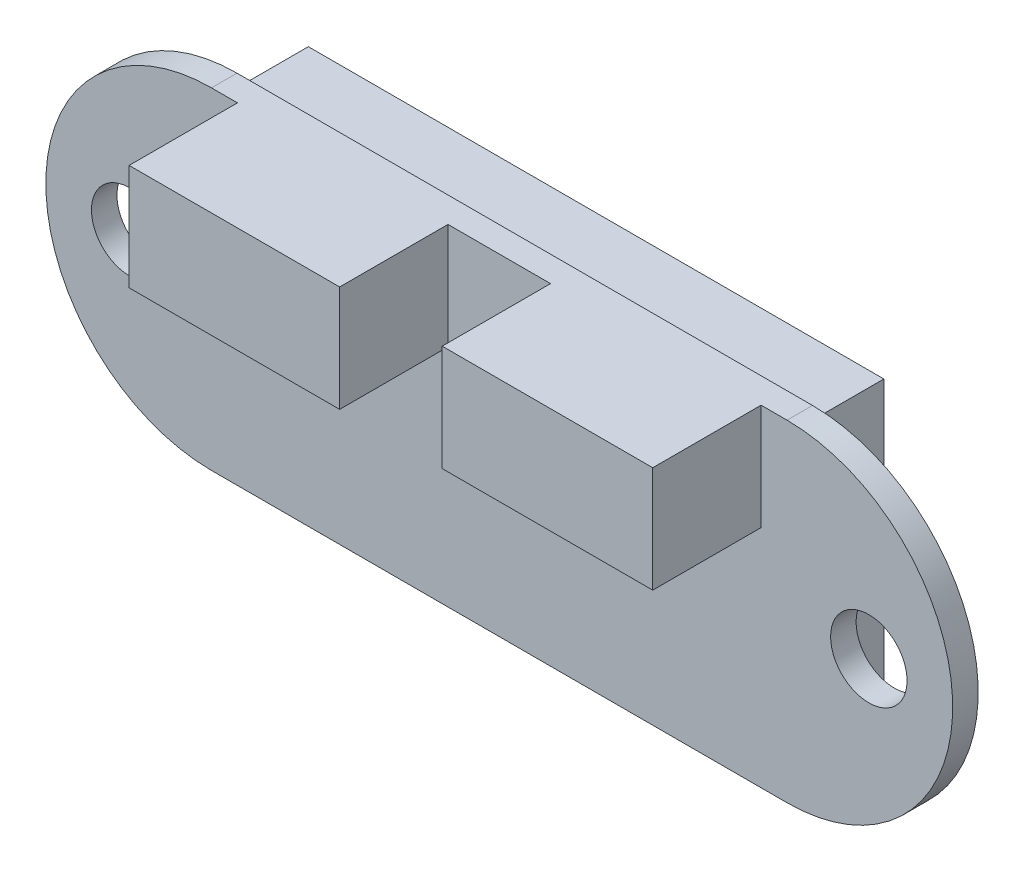
ISO-10303-21;
HEADER;
FILE_DESCRIPTION(('STEP AP214'),'2;1');
FILE_NAME('part.step','',(''),(''),'','','');
FILE_SCHEMA(('AUTOMOTIVE_DESIGN { 1 0 10303 214 1 1 1 1 }'));
ENDSEC;
DATA;
#1=APPLICATION_CONTEXT('core data for automotive mechanical design processes');
#2=APPLICATION_PROTOCOL_DEFINITION('international standard','automotive_design',2000,#1);
#3=PRODUCT_CONTEXT('',#1,'mechanical');
#4=PRODUCT('Part','Part','',(#3));
#5=PRODUCT_RELATED_PRODUCT_CATEGORY('part','',(#4));
#6=PRODUCT_DEFINITION_FORMATION('','',#4);
#7=PRODUCT_DEFINITION_CONTEXT('part definition',#1,'design');
#8=PRODUCT_DEFINITION('design','',#6,#7);
#9=PRODUCT_DEFINITION_SHAPE('','',#8);
#10=(LENGTH_UNIT() NAMED_UNIT(*) SI_UNIT(.MILLI.,.METRE.));
#11=(NAMED_UNIT(*) PLANE_ANGLE_UNIT() SI_UNIT($,.RADIAN.));
#12=(NAMED_UNIT(*) SI_UNIT($,.STERADIAN.) SOLID_ANGLE_UNIT());
#13=UNCERTAINTY_MEASURE_WITH_UNIT(LENGTH_MEASURE(1.E-05),#10,'distance_accuracy_value','');
#14=(GEOMETRIC_REPRESENTATION_CONTEXT(3) GLOBAL_UNCERTAINTY_ASSIGNED_CONTEXT((#13)) GLOBAL_UNIT_ASSIGNED_CONTEXT((#10,
#11,#12)) REPRESENTATION_CONTEXT('',''));
#15=CARTESIAN_POINT('',(0.,0.,0.));
#16=DIRECTION('',(0.,0.,1.));
#17=DIRECTION('',(1.,0.,0.));
#18=AXIS2_PLACEMENT_3D('',#15,#16,#17);
#19=CARTESIAN_POINT('',(-51.0283291556503,22.118710574771,1.));
#20=DIRECTION('',(0.,0.,1.));
#21=DIRECTION('',(1.,0.,0.));
#22=AXIS2_PLACEMENT_3D('',#19,#20,#21);
#23=PLANE('',#22);
#24=CARTESIAN_POINT('',(-76.8183291556503,22.118710574771,1.));
#25=DIRECTION('',(0.,0.,1.));
#26=DIRECTION('',(1.,0.,0.));
#27=AXIS2_PLACEMENT_3D('',#24,#25,#26);
#28=CIRCLE('',#27,1.5);
#29=CARTESIAN_POINT('',(-75.3183291556503,22.118710574771,1.));
#30=VERTEX_POINT('',#29);
#31=EDGE_CURVE('E366',#30,#30,#28,.T.);
#32=ORIENTED_EDGE('',*,*,#31,.F.);
#33=EDGE_LOOP('',(#32));
#34=FACE_BOUND('',#33,.T.);
#35=CARTESIAN_POINT('',(-47.8183291556503,22.118710574771,1.));
#36=DIRECTION('',(0.,0.,1.));
#37=DIRECTION('',(-1.,0.,0.));
#38=AXIS2_PLACEMENT_3D('',#35,#36,#37);
#39=CIRCLE('',#38,1.5);
#40=CARTESIAN_POINT('',(-49.3183291556503,22.118710574771,1.));
#41=VERTEX_POINT('',#40);
#42=EDGE_CURVE('E358',#41,#41,#39,.T.);
#43=ORIENTED_EDGE('',*,*,#42,.F.);
#44=EDGE_LOOP('',(#43));
#45=FACE_BOUND('',#44,.T.);
#46=DIRECTION('',(-1.,0.,0.));
#47=VECTOR('',#46,1.);
#48=CARTESIAN_POINT('',(-73.6083291556503,28.618710574771,1.));
#49=LINE('',#48,#47);
#50=CARTESIAN_POINT('',(-51.0283291556503,28.618710574771,1.));
#51=VERTEX_POINT('',#50);
#52=CARTESIAN_POINT('',(-52.0464927091246,28.618710574771,1.));
#53=VERTEX_POINT('',#52);
#54=EDGE_CURVE('E191',#51,#53,#49,.T.);
#55=ORIENTED_EDGE('',*,*,#54,.T.);
#56=DIRECTION('',(0.,1.,0.));
#57=VECTOR('',#56,1.);
#58=CARTESIAN_POINT('',(-52.0464927091246,24.458710574771,1.));
#59=LINE('',#58,#57);
#60=CARTESIAN_POINT('',(-52.0464927091246,24.458710574771,1.));
#61=VERTEX_POINT('',#60);
#62=EDGE_CURVE('E66',#61,#53,#59,.T.);
#63=ORIENTED_EDGE('',*,*,#62,.F.);
#64=DIRECTION('',(1.,0.,0.));
#65=VECTOR('',#64,1.);
#66=CARTESIAN_POINT('',(-52.0464927091246,24.458710574771,1.));
#67=LINE('',#66,#65);
#68=CARTESIAN_POINT('',(-60.3064927091246,24.458710574771,1.));
#69=VERTEX_POINT('',#68);
#70=EDGE_CURVE('E61',#69,#61,#67,.T.);
#71=ORIENTED_EDGE('',*,*,#70,.F.);
#72=DIRECTION('',(0.,-1.,0.));
#73=VECTOR('',#72,1.);
#74=CARTESIAN_POINT('',(-60.3064927091246,24.458710574771,1.));
#75=LINE('',#74,#73);
#76=CARTESIAN_POINT('',(-60.3064927091246,28.618710574771,1.));
#77=VERTEX_POINT('',#76);
#78=EDGE_CURVE('E194',#77,#69,#75,.T.);
#79=ORIENTED_EDGE('',*,*,#78,.F.);
#80=CARTESIAN_POINT('',(-64.3301656021761,28.618710574771,1.));
#81=VERTEX_POINT('',#80);
#82=EDGE_CURVE('E182',#77,#81,#49,.T.);
#83=ORIENTED_EDGE('',*,*,#82,.T.);
#84=DIRECTION('',(0.,1.,0.));
#85=VECTOR('',#84,1.);
#86=CARTESIAN_POINT('',(-64.3301656021761,24.458710574771,1.));
#87=LINE('',#86,#85);
#88=CARTESIAN_POINT('',(-64.3301656021761,24.458710574771,1.));
#89=VERTEX_POINT('',#88);
#90=EDGE_CURVE('E222',#89,#81,#87,.T.);
#91=ORIENTED_EDGE('',*,*,#90,.F.);
#92=DIRECTION('',(1.,0.,0.));
#93=VECTOR('',#92,1.);
#94=CARTESIAN_POINT('',(-72.5901656021761,24.458710574771,1.));
#95=LINE('',#94,#93);
#96=CARTESIAN_POINT('',(-72.5901656021761,24.458710574771,1.));
#97=VERTEX_POINT('',#96);
#98=EDGE_CURVE('E238',#97,#89,#95,.T.);
#99=ORIENTED_EDGE('',*,*,#98,.F.);
#100=DIRECTION('',(0.,-1.,0.));
#101=VECTOR('',#100,1.);
#102=CARTESIAN_POINT('',(-72.5901656021761,24.458710574771,1.));
#103=LINE('',#102,#101);
#104=CARTESIAN_POINT('',(-72.5901656021761,28.618710574771,1.));
#105=VERTEX_POINT('',#104);
#106=EDGE_CURVE('E250',#105,#97,#103,.T.);
#107=ORIENTED_EDGE('',*,*,#106,.F.);
#108=CARTESIAN_POINT('',(-73.6083291556503,28.618710574771,1.));
#109=VERTEX_POINT('',#108);
#110=EDGE_CURVE('E192',#105,#109,#49,.T.);
#111=ORIENTED_EDGE('',*,*,#110,.T.);
#112=CARTESIAN_POINT('',(-73.6083291556503,22.118710574771,1.));
#113=DIRECTION('',(0.,0.,1.));
#114=DIRECTION('',(1.,0.,0.));
#115=AXIS2_PLACEMENT_3D('',#112,#113,#114);
#116=CIRCLE('',#115,6.5);
#117=CARTESIAN_POINT('',(-73.6083291556503,15.618710574771,1.));
#118=VERTEX_POINT('',#117);
#119=EDGE_CURVE('E380',#109,#118,#116,.T.);
#120=ORIENTED_EDGE('',*,*,#119,.T.);
#121=DIRECTION('',(1.,0.,0.));
#122=VECTOR('',#121,1.);
#123=CARTESIAN_POINT('',(-73.6083291556503,15.618710574771,1.));
#124=LINE('',#123,#122);
#125=CARTESIAN_POINT('',(-51.0283291556503,15.618710574771,1.));
#126=VERTEX_POINT('',#125);
#127=EDGE_CURVE('E383',#118,#126,#124,.T.);
#128=ORIENTED_EDGE('',*,*,#127,.T.);
#129=CARTESIAN_POINT('',(-51.0283291556503,22.118710574771,1.));
#130=DIRECTION('',(0.,0.,1.));
#131=DIRECTION('',(1.,0.,0.));
#132=AXIS2_PLACEMENT_3D('',#129,#130,#131);
#133=CIRCLE('',#132,6.5);
#134=EDGE_CURVE('E374',#126,#51,#133,.T.);
#135=ORIENTED_EDGE('',*,*,#134,.T.);
#136=EDGE_LOOP('',(#55,#63,#71,#79,#83,#91,#99,#107,#111,#120,#128,#135));
#137=FACE_BOUND('',#136,.T.);
#138=ADVANCED_FACE('F45',(#34,#45,#137),#23,.T.);
#139=CARTESIAN_POINT('',(-51.0283291556503,22.118710574771,0.));
#140=DIRECTION('',(0.,0.,1.));
#141=DIRECTION('',(1.,0.,0.));
#142=AXIS2_PLACEMENT_3D('',#139,#140,#141);
#143=PLANE('',#142);
#144=CARTESIAN_POINT('',(-51.0283291556503,22.118710574771,0.));
#145=DIRECTION('',(0.,0.,1.));
#146=DIRECTION('',(1.,0.,0.));
#147=AXIS2_PLACEMENT_3D('',#144,#145,#146);
#148=CIRCLE('',#147,6.5);
#149=CARTESIAN_POINT('',(-51.0283291556503,15.618710574771,0.));
#150=VERTEX_POINT('',#149);
#151=CARTESIAN_POINT('',(-51.0283291556503,28.618710574771,0.));
#152=VERTEX_POINT('',#151);
#153=EDGE_CURVE('E370',#150,#152,#148,.T.);
#154=ORIENTED_EDGE('',*,*,#153,.F.);
#155=DIRECTION('',(1.,0.,0.));
#156=VECTOR('',#155,1.);
#157=CARTESIAN_POINT('',(-73.6083291556503,15.618710574771,0.));
#158=LINE('',#157,#156);
#159=CARTESIAN_POINT('',(-73.6083291556503,15.618710574771,0.));
#160=VERTEX_POINT('',#159);
#161=EDGE_CURVE('E377',#160,#150,#158,.T.);
#162=ORIENTED_EDGE('',*,*,#161,.F.);
#163=CARTESIAN_POINT('',(-73.6083291556503,22.118710574771,0.));
#164=DIRECTION('',(0.,0.,1.));
#165=DIRECTION('',(1.,0.,0.));
#166=AXIS2_PLACEMENT_3D('',#163,#164,#165);
#167=CIRCLE('',#166,6.5);
#168=CARTESIAN_POINT('',(-73.6083291556503,28.618710574771,0.));
#169=VERTEX_POINT('',#168);
#170=EDGE_CURVE('E393',#169,#160,#167,.T.);
#171=ORIENTED_EDGE('',*,*,#170,.F.);
#172=DIRECTION('',(-1.,0.,0.));
#173=VECTOR('',#172,1.);
#174=CARTESIAN_POINT('',(-73.6083291556503,28.618710574771,0.));
#175=LINE('',#174,#173);
#176=EDGE_CURVE('E390',#152,#169,#175,.T.);
#177=ORIENTED_EDGE('',*,*,#176,.F.);
#178=EDGE_LOOP('',(#154,#162,#171,#177));
#179=FACE_BOUND('',#178,.T.);
#180=CARTESIAN_POINT('',(-76.8183291556503,22.118710574771,0.));
#181=DIRECTION('',(0.,0.,1.));
#182=DIRECTION('',(1.,0.,0.));
#183=AXIS2_PLACEMENT_3D('',#180,#181,#182);
#184=CIRCLE('',#183,1.5);
#185=CARTESIAN_POINT('',(-75.3183291556503,22.118710574771,0.));
#186=VERTEX_POINT('',#185);
#187=EDGE_CURVE('E362',#186,#186,#184,.T.);
#188=ORIENTED_EDGE('',*,*,#187,.T.);
#189=EDGE_LOOP('',(#188));
#190=FACE_BOUND('',#189,.T.);
#191=CARTESIAN_POINT('',(-47.8183291556503,22.118710574771,0.));
#192=DIRECTION('',(0.,0.,1.));
#193=DIRECTION('',(-1.,0.,0.));
#194=AXIS2_PLACEMENT_3D('',#191,#192,#193);
#195=CIRCLE('',#194,1.5);
#196=CARTESIAN_POINT('',(-49.3183291556503,22.118710574771,0.));
#197=VERTEX_POINT('',#196);
#198=EDGE_CURVE('E357',#197,#197,#195,.T.);
#199=ORIENTED_EDGE('',*,*,#198,.T.);
#200=EDGE_LOOP('',(#199));
#201=FACE_BOUND('',#200,.T.);
#202=DIRECTION('',(0.,-1.,0.));
#203=VECTOR('',#202,1.);
#204=CARTESIAN_POINT('',(-51.0283291556503,28.118710574771,0.));
#205=LINE('',#204,#203);
#206=CARTESIAN_POINT('',(-51.0283291556503,28.118710574771,0.));
#207=VERTEX_POINT('',#206);
#208=CARTESIAN_POINT('',(-51.0283291556503,16.118710574771,0.));
#209=VERTEX_POINT('',#208);
#210=EDGE_CURVE('E312',#207,#209,#205,.T.);
#211=ORIENTED_EDGE('',*,*,#210,.F.);
#212=DIRECTION('',(1.,0.,0.));
#213=VECTOR('',#212,1.);
#214=CARTESIAN_POINT('',(-73.6083291556504,28.118710574771,0.));
#215=LINE('',#214,#213);
#216=CARTESIAN_POINT('',(-73.6083291556504,28.118710574771,0.));
#217=VERTEX_POINT('',#216);
#218=EDGE_CURVE('E318',#217,#207,#215,.T.);
#219=ORIENTED_EDGE('',*,*,#218,.F.);
#220=DIRECTION('',(0.,1.,0.));
#221=VECTOR('',#220,1.);
#222=CARTESIAN_POINT('',(-73.6083291556504,28.118710574771,0.));
#223=LINE('',#222,#221);
#224=CARTESIAN_POINT('',(-73.6083291556504,16.118710574771,0.));
#225=VERTEX_POINT('',#224);
#226=EDGE_CURVE('E335',#225,#217,#223,.T.);
#227=ORIENTED_EDGE('',*,*,#226,.F.);
#228=DIRECTION('',(-1.,0.,0.));
#229=VECTOR('',#228,1.);
#230=CARTESIAN_POINT('',(-73.6083291556504,16.118710574771,0.));
#231=LINE('',#230,#229);
#232=EDGE_CURVE('E331',#209,#225,#231,.T.);
#233=ORIENTED_EDGE('',*,*,#232,.F.);
#234=EDGE_LOOP('',(#211,#219,#227,#233));
#235=FACE_BOUND('',#234,.T.);
#236=ADVANCED_FACE('F416',(#179,#190,#201,#235),#143,.F.);
#237=CARTESIAN_POINT('',(-51.0283291556503,22.118710574771,1.));
#238=DIRECTION('',(0.,0.,-1.));
#239=DIRECTION('',(-1.,0.,0.));
#240=AXIS2_PLACEMENT_3D('',#237,#238,#239);
#241=CYLINDRICAL_SURFACE('',#240,6.5);
#242=ORIENTED_EDGE('',*,*,#153,.T.);
#243=DIRECTION('',(0.,0.,-1.));
#244=VECTOR('',#243,1.);
#245=CARTESIAN_POINT('',(-51.0283291556503,28.618710574771,1.));
#246=LINE('',#245,#244);
#247=EDGE_CURVE('E11',#51,#152,#246,.T.);
#248=ORIENTED_EDGE('',*,*,#247,.F.);
#249=ORIENTED_EDGE('',*,*,#134,.F.);
#250=DIRECTION('',(0.,0.,-1.));
#251=VECTOR('',#250,1.);
#252=CARTESIAN_POINT('',(-51.0283291556503,15.618710574771,1.));
#253=LINE('',#252,#251);
#254=EDGE_CURVE('E386',#126,#150,#253,.T.);
#255=ORIENTED_EDGE('',*,*,#254,.T.);
#256=EDGE_LOOP('',(#242,#248,#249,#255));
#257=FACE_BOUND('',#256,.T.);
#258=ADVANCED_FACE('F47',(#257),#241,.T.);
#259=CARTESIAN_POINT('',(-73.6083291556503,28.618710574771,1.));
#260=DIRECTION('',(0.,-1.,0.));
#261=DIRECTION('',(0.,0.,-1.));
#262=AXIS2_PLACEMENT_3D('',#259,#260,#261);
#263=PLANE('',#262);
#264=ORIENTED_EDGE('',*,*,#176,.T.);
#265=DIRECTION('',(0.,0.,-1.));
#266=VECTOR('',#265,1.);
#267=CARTESIAN_POINT('',(-73.6083291556503,28.618710574771,1.));
#268=LINE('',#267,#266);
#269=EDGE_CURVE('E54',#109,#169,#268,.T.);
#270=ORIENTED_EDGE('',*,*,#269,.F.);
#271=ORIENTED_EDGE('',*,*,#110,.F.);
#272=DIRECTION('',(0.,0.,-1.));
#273=VECTOR('',#272,1.);
#274=CARTESIAN_POINT('',(-72.5901656021761,28.618710574771,5.25));
#275=LINE('',#274,#273);
#276=CARTESIAN_POINT('',(-72.5901656021761,28.618710574771,5.25));
#277=VERTEX_POINT('',#276);
#278=EDGE_CURVE('E264',#277,#105,#275,.T.);
#279=ORIENTED_EDGE('',*,*,#278,.F.);
#280=DIRECTION('',(-1.,0.,0.));
#281=VECTOR('',#280,1.);
#282=CARTESIAN_POINT('',(-72.5901656021761,28.618710574771,5.25));
#283=LINE('',#282,#281);
#284=CARTESIAN_POINT('',(-64.3301656021761,28.618710574771,5.25));
#285=VERTEX_POINT('',#284);
#286=EDGE_CURVE('E237',#285,#277,#283,.T.);
#287=ORIENTED_EDGE('',*,*,#286,.F.);
#288=DIRECTION('',(0.,0.,-1.));
#289=VECTOR('',#288,1.);
#290=CARTESIAN_POINT('',(-64.3301656021761,28.618710574771,5.25));
#291=LINE('',#290,#289);
#292=EDGE_CURVE('E188',#285,#81,#291,.T.);
#293=ORIENTED_EDGE('',*,*,#292,.T.);
#294=ORIENTED_EDGE('',*,*,#82,.F.);
#295=DIRECTION('',(0.,0.,-1.));
#296=VECTOR('',#295,1.);
#297=CARTESIAN_POINT('',(-60.3064927091246,28.618710574771,5.25));
#298=LINE('',#297,#296);
#299=CARTESIAN_POINT('',(-60.3064927091246,28.618710574771,5.25));
#300=VERTEX_POINT('',#299);
#301=EDGE_CURVE('E185',#300,#77,#298,.T.);
#302=ORIENTED_EDGE('',*,*,#301,.F.);
#303=DIRECTION('',(-1.,0.,0.));
#304=VECTOR('',#303,1.);
#305=CARTESIAN_POINT('',(-52.0464927091246,28.618710574771,5.25));
#306=LINE('',#305,#304);
#307=CARTESIAN_POINT('',(-52.0464927091246,28.618710574771,5.25));
#308=VERTEX_POINT('',#307);
#309=EDGE_CURVE('E227',#308,#300,#306,.T.);
#310=ORIENTED_EDGE('',*,*,#309,.F.);
#311=DIRECTION('',(0.,0.,-1.));
#312=VECTOR('',#311,1.);
#313=CARTESIAN_POINT('',(-52.0464927091246,28.618710574771,5.25));
#314=LINE('',#313,#312);
#315=EDGE_CURVE('E204',#308,#53,#314,.T.);
#316=ORIENTED_EDGE('',*,*,#315,.T.);
#317=ORIENTED_EDGE('',*,*,#54,.F.);
#318=ORIENTED_EDGE('',*,*,#247,.T.);
#319=EDGE_LOOP('',(#264,#270,#271,#279,#287,#293,#294,#302,#310,#316,#317,#318));
#320=FACE_BOUND('',#319,.T.);
#321=ADVANCED_FACE('F183',(#320),#263,.F.);
#322=CARTESIAN_POINT('',(-73.6083291556503,22.118710574771,1.));
#323=DIRECTION('',(0.,0.,-1.));
#324=DIRECTION('',(-1.,0.,0.));
#325=AXIS2_PLACEMENT_3D('',#322,#323,#324);
#326=CYLINDRICAL_SURFACE('',#325,6.5);
#327=ORIENTED_EDGE('',*,*,#170,.T.);
#328=DIRECTION('',(0.,0.,-1.));
#329=VECTOR('',#328,1.);
#330=CARTESIAN_POINT('',(-73.6083291556503,15.618710574771,1.));
#331=LINE('',#330,#329);
#332=EDGE_CURVE('E401',#118,#160,#331,.T.);
#333=ORIENTED_EDGE('',*,*,#332,.F.);
#334=ORIENTED_EDGE('',*,*,#119,.F.);
#335=ORIENTED_EDGE('',*,*,#269,.T.);
#336=EDGE_LOOP('',(#327,#333,#334,#335));
#337=FACE_BOUND('',#336,.T.);
#338=ADVANCED_FACE('F410',(#337),#326,.T.);
#339=CARTESIAN_POINT('',(-73.6083291556503,15.618710574771,1.));
#340=DIRECTION('',(0.,1.,0.));
#341=DIRECTION('',(0.,0.,1.));
#342=AXIS2_PLACEMENT_3D('',#339,#340,#341);
#343=PLANE('',#342);
#344=ORIENTED_EDGE('',*,*,#161,.T.);
#345=ORIENTED_EDGE('',*,*,#254,.F.);
#346=ORIENTED_EDGE('',*,*,#127,.F.);
#347=ORIENTED_EDGE('',*,*,#332,.T.);
#348=EDGE_LOOP('',(#344,#345,#346,#347));
#349=FACE_BOUND('',#348,.T.);
#350=ADVANCED_FACE('F420',(#349),#343,.F.);
#351=CARTESIAN_POINT('',(-76.8183291556503,22.118710574771,1.));
#352=DIRECTION('',(0.,0.,-1.));
#353=DIRECTION('',(-1.,0.,0.));
#354=AXIS2_PLACEMENT_3D('',#351,#352,#353);
#355=CYLINDRICAL_SURFACE('',#354,1.5);
#356=ORIENTED_EDGE('',*,*,#31,.T.);
#357=EDGE_LOOP('',(#356));
#358=FACE_BOUND('',#357,.T.);
#359=ORIENTED_EDGE('',*,*,#187,.F.);
#360=EDGE_LOOP('',(#359));
#361=FACE_BOUND('',#360,.T.);
#362=ADVANCED_FACE('F462',(#358,#361),#355,.F.);
#363=CARTESIAN_POINT('',(-47.8183291556503,22.118710574771,1.));
#364=DIRECTION('',(0.,0.,-1.));
#365=DIRECTION('',(-1.,0.,0.));
#366=AXIS2_PLACEMENT_3D('',#363,#364,#365);
#367=CYLINDRICAL_SURFACE('',#366,1.5);
#368=ORIENTED_EDGE('',*,*,#42,.T.);
#369=EDGE_LOOP('',(#368));
#370=FACE_BOUND('',#369,.T.);
#371=ORIENTED_EDGE('',*,*,#198,.F.);
#372=EDGE_LOOP('',(#371));
#373=FACE_BOUND('',#372,.T.);
#374=ADVANCED_FACE('F495',(#370,#373),#367,.F.);
#375=CARTESIAN_POINT('',(0.,0.,-2.8));
#376=DIRECTION('',(0.,0.,1.));
#377=DIRECTION('',(1.,0.,0.));
#378=AXIS2_PLACEMENT_3D('',#375,#376,#377);
#379=PLANE('',#378);
#380=DIRECTION('',(0.,-1.,0.));
#381=VECTOR('',#380,1.);
#382=CARTESIAN_POINT('',(-51.0283291556503,28.118710574771,-2.8));
#383=LINE('',#382,#381);
#384=CARTESIAN_POINT('',(-51.0283291556503,28.118710574771,-2.8));
#385=VERTEX_POINT('',#384);
#386=CARTESIAN_POINT('',(-51.0283291556503,16.118710574771,-2.8));
#387=VERTEX_POINT('',#386);
#388=EDGE_CURVE('E313',#385,#387,#383,.T.);
#389=ORIENTED_EDGE('',*,*,#388,.T.);
#390=DIRECTION('',(-1.,0.,0.));
#391=VECTOR('',#390,1.);
#392=CARTESIAN_POINT('',(-73.6083291556504,16.118710574771,-2.8));
#393=LINE('',#392,#391);
#394=CARTESIAN_POINT('',(-73.6083291556504,16.118710574771,-2.8));
#395=VERTEX_POINT('',#394);
#396=EDGE_CURVE('E317',#387,#395,#393,.T.);
#397=ORIENTED_EDGE('',*,*,#396,.T.);
#398=DIRECTION('',(0.,1.,0.));
#399=VECTOR('',#398,1.);
#400=CARTESIAN_POINT('',(-73.6083291556504,28.118710574771,-2.8));
#401=LINE('',#400,#399);
#402=CARTESIAN_POINT('',(-73.6083291556504,28.118710574771,-2.8));
#403=VERTEX_POINT('',#402);
#404=EDGE_CURVE('E321',#395,#403,#401,.T.);
#405=ORIENTED_EDGE('',*,*,#404,.T.);
#406=DIRECTION('',(1.,0.,0.));
#407=VECTOR('',#406,1.);
#408=CARTESIAN_POINT('',(-73.6083291556504,28.118710574771,-2.8));
#409=LINE('',#408,#407);
#410=EDGE_CURVE('E324',#403,#385,#409,.T.);
#411=ORIENTED_EDGE('',*,*,#410,.T.);
#412=EDGE_LOOP('',(#389,#397,#405,#411));
#413=FACE_BOUND('',#412,.T.);
#414=DIRECTION('',(0.,-1.,0.));
#415=VECTOR('',#414,1.);
#416=CARTESIAN_POINT('',(-55.0900262354061,24.118710574771,-2.8));
#417=LINE('',#416,#415);
#418=CARTESIAN_POINT('',(-55.0900262354061,24.118710574771,-2.8));
#419=VERTEX_POINT('',#418);
#420=CARTESIAN_POINT('',(-55.0900262354061,20.118710574771,-2.8));
#421=VERTEX_POINT('',#420);
#422=EDGE_CURVE('E271',#419,#421,#417,.T.);
#423=ORIENTED_EDGE('',*,*,#422,.F.);
#424=DIRECTION('',(1.,0.,0.));
#425=VECTOR('',#424,1.);
#426=CARTESIAN_POINT('',(-61.0900262354061,24.118710574771,-2.8));
#427=LINE('',#426,#425);
#428=CARTESIAN_POINT('',(-61.0900262354061,24.118710574771,-2.8));
#429=VERTEX_POINT('',#428);
#430=EDGE_CURVE('E282',#429,#419,#427,.T.);
#431=ORIENTED_EDGE('',*,*,#430,.F.);
#432=DIRECTION('',(0.,1.,0.));
#433=VECTOR('',#432,1.);
#434=CARTESIAN_POINT('',(-61.0900262354061,24.118710574771,-2.8));
#435=LINE('',#434,#433);
#436=CARTESIAN_POINT('',(-61.0900262354061,20.118710574771,-2.8));
#437=VERTEX_POINT('',#436);
#438=EDGE_CURVE('E278',#437,#429,#435,.T.);
#439=ORIENTED_EDGE('',*,*,#438,.F.);
#440=DIRECTION('',(-1.,0.,0.));
#441=VECTOR('',#440,1.);
#442=CARTESIAN_POINT('',(-61.0900262354061,20.118710574771,-2.8));
#443=LINE('',#442,#441);
#444=EDGE_CURVE('E274',#421,#437,#443,.T.);
#445=ORIENTED_EDGE('',*,*,#444,.F.);
#446=EDGE_LOOP('',(#423,#431,#439,#445));
#447=FACE_BOUND('',#446,.T.);
#448=ADVANCED_FACE('F502',(#413,#447),#379,.F.);
#449=CARTESIAN_POINT('',(-51.0283291556503,28.118710574771,-2.8));
#450=DIRECTION('',(-1.,0.,0.));
#451=DIRECTION('',(0.,0.,1.));
#452=AXIS2_PLACEMENT_3D('',#449,#450,#451);
#453=PLANE('',#452);
#454=ORIENTED_EDGE('',*,*,#210,.T.);
#455=DIRECTION('',(0.,0.,1.));
#456=VECTOR('',#455,1.);
#457=CARTESIAN_POINT('',(-51.0283291556503,16.118710574771,-2.8));
#458=LINE('',#457,#456);
#459=EDGE_CURVE('E353',#387,#209,#458,.T.);
#460=ORIENTED_EDGE('',*,*,#459,.F.);
#461=ORIENTED_EDGE('',*,*,#388,.F.);
#462=DIRECTION('',(0.,0.,1.));
#463=VECTOR('',#462,1.);
#464=CARTESIAN_POINT('',(-51.0283291556503,28.118710574771,-2.8));
#465=LINE('',#464,#463);
#466=EDGE_CURVE('E327',#385,#207,#465,.T.);
#467=ORIENTED_EDGE('',*,*,#466,.T.);
#468=EDGE_LOOP('',(#454,#460,#461,#467));
#469=FACE_BOUND('',#468,.T.);
#470=ADVANCED_FACE('F509',(#469),#453,.F.);
#471=CARTESIAN_POINT('',(-73.6083291556504,16.118710574771,-2.8));
#472=DIRECTION('',(0.,1.,0.));
#473=DIRECTION('',(-1.,0.,0.));
#474=AXIS2_PLACEMENT_3D('',#471,#472,#473);
#475=PLANE('',#474);
#476=ORIENTED_EDGE('',*,*,#232,.T.);
#477=DIRECTION('',(0.,0.,1.));
#478=VECTOR('',#477,1.);
#479=CARTESIAN_POINT('',(-73.6083291556504,16.118710574771,-2.8));
#480=LINE('',#479,#478);
#481=EDGE_CURVE('E349',#395,#225,#480,.T.);
#482=ORIENTED_EDGE('',*,*,#481,.F.);
#483=ORIENTED_EDGE('',*,*,#396,.F.);
#484=ORIENTED_EDGE('',*,*,#459,.T.);
#485=EDGE_LOOP('',(#476,#482,#483,#484));
#486=FACE_BOUND('',#485,.T.);
#487=ADVANCED_FACE('F518',(#486),#475,.F.);
#488=CARTESIAN_POINT('',(-73.6083291556504,28.118710574771,-2.8));
#489=DIRECTION('',(1.,0.,0.));
#490=DIRECTION('',(0.,0.,-1.));
#491=AXIS2_PLACEMENT_3D('',#488,#489,#490);
#492=PLANE('',#491);
#493=ORIENTED_EDGE('',*,*,#226,.T.);
#494=DIRECTION('',(0.,0.,1.));
#495=VECTOR('',#494,1.);
#496=CARTESIAN_POINT('',(-73.6083291556504,28.118710574771,-2.8));
#497=LINE('',#496,#495);
#498=EDGE_CURVE('E345',#403,#217,#497,.T.);
#499=ORIENTED_EDGE('',*,*,#498,.F.);
#500=ORIENTED_EDGE('',*,*,#404,.F.);
#501=ORIENTED_EDGE('',*,*,#481,.T.);
#502=EDGE_LOOP('',(#493,#499,#500,#501));
#503=FACE_BOUND('',#502,.T.);
#504=ADVANCED_FACE('F527',(#503),#492,.F.);
#505=CARTESIAN_POINT('',(-73.6083291556504,28.118710574771,-2.8));
#506=DIRECTION('',(0.,-1.,0.));
#507=DIRECTION('',(1.,0.,0.));
#508=AXIS2_PLACEMENT_3D('',#505,#506,#507);
#509=PLANE('',#508);
#510=ORIENTED_EDGE('',*,*,#218,.T.);
#511=ORIENTED_EDGE('',*,*,#466,.F.);
#512=ORIENTED_EDGE('',*,*,#410,.F.);
#513=ORIENTED_EDGE('',*,*,#498,.T.);
#514=EDGE_LOOP('',(#510,#511,#512,#513));
#515=FACE_BOUND('',#514,.T.);
#516=ADVANCED_FACE('F534',(#515),#509,.F.);
#517=CARTESIAN_POINT('',(-55.0900262354061,24.118710574771,-2.8));
#518=DIRECTION('',(-1.,0.,0.));
#519=DIRECTION('',(0.,0.,1.));
#520=AXIS2_PLACEMENT_3D('',#517,#518,#519);
#521=PLANE('',#520);
#522=DIRECTION('',(0.,-1.,0.));
#523=VECTOR('',#522,1.);
#524=CARTESIAN_POINT('',(-55.0900262354061,24.118710574771,0.));
#525=LINE('',#524,#523);
#526=CARTESIAN_POINT('',(-55.0900262354061,24.118710574771,0.));
#527=VERTEX_POINT('',#526);
#528=CARTESIAN_POINT('',(-55.0900262354061,20.118710574771,0.));
#529=VERTEX_POINT('',#528);
#530=EDGE_CURVE('E270',#527,#529,#525,.T.);
#531=ORIENTED_EDGE('',*,*,#530,.F.);
#532=DIRECTION('',(0.,0.,1.));
#533=VECTOR('',#532,1.);
#534=CARTESIAN_POINT('',(-55.0900262354061,24.118710574771,-2.8));
#535=LINE('',#534,#533);
#536=EDGE_CURVE('E285',#419,#527,#535,.T.);
#537=ORIENTED_EDGE('',*,*,#536,.F.);
#538=ORIENTED_EDGE('',*,*,#422,.T.);
#539=DIRECTION('',(0.,0.,1.));
#540=VECTOR('',#539,1.);
#541=CARTESIAN_POINT('',(-55.0900262354061,20.118710574771,-2.8));
#542=LINE('',#541,#540);
#543=EDGE_CURVE('E308',#421,#529,#542,.T.);
#544=ORIENTED_EDGE('',*,*,#543,.T.);
#545=EDGE_LOOP('',(#531,#537,#538,#544));
#546=FACE_BOUND('',#545,.T.);
#547=ADVANCED_FACE('F541',(#546),#521,.T.);
#548=CARTESIAN_POINT('',(-61.0900262354061,20.118710574771,-2.8));
#549=DIRECTION('',(0.,1.,0.));
#550=DIRECTION('',(0.,0.,1.));
#551=AXIS2_PLACEMENT_3D('',#548,#549,#550);
#552=PLANE('',#551);
#553=DIRECTION('',(-1.,0.,0.));
#554=VECTOR('',#553,1.);
#555=CARTESIAN_POINT('',(-61.0900262354061,20.118710574771,0.));
#556=LINE('',#555,#554);
#557=CARTESIAN_POINT('',(-61.0900262354061,20.118710574771,0.));
#558=VERTEX_POINT('',#557);
#559=EDGE_CURVE('E289',#529,#558,#556,.T.);
#560=ORIENTED_EDGE('',*,*,#559,.F.);
#561=ORIENTED_EDGE('',*,*,#543,.F.);
#562=ORIENTED_EDGE('',*,*,#444,.T.);
#563=DIRECTION('',(0.,0.,1.));
#564=VECTOR('',#563,1.);
#565=CARTESIAN_POINT('',(-61.0900262354061,20.118710574771,-2.8));
#566=LINE('',#565,#564);
#567=EDGE_CURVE('E305',#437,#558,#566,.T.);
#568=ORIENTED_EDGE('',*,*,#567,.T.);
#569=EDGE_LOOP('',(#560,#561,#562,#568));
#570=FACE_BOUND('',#569,.T.);
#571=ADVANCED_FACE('F550',(#570),#552,.T.);
#572=CARTESIAN_POINT('',(-61.0900262354061,24.118710574771,-2.8));
#573=DIRECTION('',(1.,0.,0.));
#574=DIRECTION('',(0.,0.,-1.));
#575=AXIS2_PLACEMENT_3D('',#572,#573,#574);
#576=PLANE('',#575);
#577=DIRECTION('',(0.,1.,0.));
#578=VECTOR('',#577,1.);
#579=CARTESIAN_POINT('',(-61.0900262354061,24.118710574771,0.));
#580=LINE('',#579,#578);
#581=CARTESIAN_POINT('',(-61.0900262354061,24.118710574771,0.));
#582=VERTEX_POINT('',#581);
#583=EDGE_CURVE('E293',#558,#582,#580,.T.);
#584=ORIENTED_EDGE('',*,*,#583,.F.);
#585=ORIENTED_EDGE('',*,*,#567,.F.);
#586=ORIENTED_EDGE('',*,*,#438,.T.);
#587=DIRECTION('',(0.,0.,1.));
#588=VECTOR('',#587,1.);
#589=CARTESIAN_POINT('',(-61.0900262354061,24.118710574771,-2.8));
#590=LINE('',#589,#588);
#591=EDGE_CURVE('E302',#429,#582,#590,.T.);
#592=ORIENTED_EDGE('',*,*,#591,.T.);
#593=EDGE_LOOP('',(#584,#585,#586,#592));
#594=FACE_BOUND('',#593,.T.);
#595=ADVANCED_FACE('F558',(#594),#576,.T.);
#596=CARTESIAN_POINT('',(-61.0900262354061,24.118710574771,-2.8));
#597=DIRECTION('',(0.,-1.,0.));
#598=DIRECTION('',(0.,0.,-1.));
#599=AXIS2_PLACEMENT_3D('',#596,#597,#598);
#600=PLANE('',#599);
#601=DIRECTION('',(1.,0.,0.));
#602=VECTOR('',#601,1.);
#603=CARTESIAN_POINT('',(-61.0900262354061,24.118710574771,0.));
#604=LINE('',#603,#602);
#605=EDGE_CURVE('E275',#582,#527,#604,.T.);
#606=ORIENTED_EDGE('',*,*,#605,.F.);
#607=ORIENTED_EDGE('',*,*,#591,.F.);
#608=ORIENTED_EDGE('',*,*,#430,.T.);
#609=ORIENTED_EDGE('',*,*,#536,.T.);
#610=EDGE_LOOP('',(#606,#607,#608,#609));
#611=FACE_BOUND('',#610,.T.);
#612=ADVANCED_FACE('F466',(#611),#600,.T.);
#613=ORIENTED_EDGE('',*,*,#605,.T.);
#614=ORIENTED_EDGE('',*,*,#530,.T.);
#615=ORIENTED_EDGE('',*,*,#559,.T.);
#616=ORIENTED_EDGE('',*,*,#583,.T.);
#617=EDGE_LOOP('',(#613,#614,#615,#616));
#618=FACE_BOUND('',#617,.T.);
#619=ADVANCED_FACE('F458',(#618),#143,.F.);
#620=CARTESIAN_POINT('',(-64.3301656021761,24.458710574771,5.25));
#621=DIRECTION('',(-1.,0.,0.));
#622=DIRECTION('',(0.,0.,1.));
#623=AXIS2_PLACEMENT_3D('',#620,#621,#622);
#624=PLANE('',#623);
#625=ORIENTED_EDGE('',*,*,#90,.T.);
#626=ORIENTED_EDGE('',*,*,#292,.F.);
#627=DIRECTION('',(0.,1.,0.));
#628=VECTOR('',#627,1.);
#629=CARTESIAN_POINT('',(-64.3301656021761,24.458710574771,5.25));
#630=LINE('',#629,#628);
#631=CARTESIAN_POINT('',(-64.3301656021761,24.458710574771,5.25));
#632=VERTEX_POINT('',#631);
#633=EDGE_CURVE('E233',#632,#285,#630,.T.);
#634=ORIENTED_EDGE('',*,*,#633,.F.);
#635=DIRECTION('',(0.,0.,-1.));
#636=VECTOR('',#635,1.);
#637=CARTESIAN_POINT('',(-64.3301656021761,24.458710574771,5.25));
#638=LINE('',#637,#636);
#639=EDGE_CURVE('E247',#632,#89,#638,.T.);
#640=ORIENTED_EDGE('',*,*,#639,.T.);
#641=EDGE_LOOP('',(#625,#626,#634,#640));
#642=FACE_BOUND('',#641,.T.);
#643=ADVANCED_FACE('F437',(#642),#624,.F.);
#644=CARTESIAN_POINT('',(-72.5901656021761,24.458710574771,5.25));
#645=DIRECTION('',(1.,0.,0.));
#646=DIRECTION('',(0.,0.,-1.));
#647=AXIS2_PLACEMENT_3D('',#644,#645,#646);
#648=PLANE('',#647);
#649=ORIENTED_EDGE('',*,*,#106,.T.);
#650=DIRECTION('',(0.,0.,-1.));
#651=VECTOR('',#650,1.);
#652=CARTESIAN_POINT('',(-72.5901656021761,24.458710574771,5.25));
#653=LINE('',#652,#651);
#654=CARTESIAN_POINT('',(-72.5901656021761,24.458710574771,5.25));
#655=VERTEX_POINT('',#654);
#656=EDGE_CURVE('E260',#655,#97,#653,.T.);
#657=ORIENTED_EDGE('',*,*,#656,.F.);
#658=DIRECTION('',(0.,-1.,0.));
#659=VECTOR('',#658,1.);
#660=CARTESIAN_POINT('',(-72.5901656021761,24.458710574771,5.25));
#661=LINE('',#660,#659);
#662=EDGE_CURVE('E241',#277,#655,#661,.T.);
#663=ORIENTED_EDGE('',*,*,#662,.F.);
#664=ORIENTED_EDGE('',*,*,#278,.T.);
#665=EDGE_LOOP('',(#649,#657,#663,#664));
#666=FACE_BOUND('',#665,.T.);
#667=ADVANCED_FACE('F429',(#666),#648,.F.);
#668=CARTESIAN_POINT('',(-72.5901656021761,24.458710574771,5.25));
#669=DIRECTION('',(0.,1.,0.));
#670=DIRECTION('',(0.,0.,1.));
#671=AXIS2_PLACEMENT_3D('',#668,#669,#670);
#672=PLANE('',#671);
#673=ORIENTED_EDGE('',*,*,#98,.T.);
#674=ORIENTED_EDGE('',*,*,#639,.F.);
#675=DIRECTION('',(1.,0.,0.));
#676=VECTOR('',#675,1.);
#677=CARTESIAN_POINT('',(-72.5901656021761,24.458710574771,5.25));
#678=LINE('',#677,#676);
#679=EDGE_CURVE('E244',#655,#632,#678,.T.);
#680=ORIENTED_EDGE('',*,*,#679,.F.);
#681=ORIENTED_EDGE('',*,*,#656,.T.);
#682=EDGE_LOOP('',(#673,#674,#680,#681));
#683=FACE_BOUND('',#682,.T.);
#684=ADVANCED_FACE('F439',(#683),#672,.F.);
#685=CARTESIAN_POINT('',(0.,0.,5.25));
#686=DIRECTION('',(0.,0.,-1.));
#687=DIRECTION('',(-1.,0.,0.));
#688=AXIS2_PLACEMENT_3D('',#685,#686,#687);
#689=PLANE('',#688);
#690=ORIENTED_EDGE('',*,*,#633,.T.);
#691=ORIENTED_EDGE('',*,*,#286,.T.);
#692=ORIENTED_EDGE('',*,*,#662,.T.);
#693=ORIENTED_EDGE('',*,*,#679,.T.);
#694=EDGE_LOOP('',(#690,#691,#692,#693));
#695=FACE_BOUND('',#694,.T.);
#696=ADVANCED_FACE('F433',(#695),#689,.F.);
#697=CARTESIAN_POINT('',(-52.0464927091246,24.458710574771,5.25));
#698=DIRECTION('',(-1.,0.,0.));
#699=DIRECTION('',(0.,0.,1.));
#700=AXIS2_PLACEMENT_3D('',#697,#698,#699);
#701=PLANE('',#700);
#702=ORIENTED_EDGE('',*,*,#62,.T.);
#703=ORIENTED_EDGE('',*,*,#315,.F.);
#704=DIRECTION('',(0.,1.,0.));
#705=VECTOR('',#704,1.);
#706=CARTESIAN_POINT('',(-52.0464927091246,24.458710574771,5.25));
#707=LINE('',#706,#705);
#708=CARTESIAN_POINT('',(-52.0464927091246,24.458710574771,5.25));
#709=VERTEX_POINT('',#708);
#710=EDGE_CURVE('E218',#709,#308,#707,.T.);
#711=ORIENTED_EDGE('',*,*,#710,.F.);
#712=DIRECTION('',(0.,0.,-1.));
#713=VECTOR('',#712,1.);
#714=CARTESIAN_POINT('',(-52.0464927091246,24.458710574771,5.25));
#715=LINE('',#714,#713);
#716=EDGE_CURVE('E208',#709,#61,#715,.T.);
#717=ORIENTED_EDGE('',*,*,#716,.T.);
#718=EDGE_LOOP('',(#702,#703,#711,#717));
#719=FACE_BOUND('',#718,.T.);
#720=ADVANCED_FACE('F446',(#719),#701,.F.);
#721=CARTESIAN_POINT('',(-60.3064927091246,24.458710574771,5.25));
#722=DIRECTION('',(1.,0.,0.));
#723=DIRECTION('',(0.,0.,-1.));
#724=AXIS2_PLACEMENT_3D('',#721,#722,#723);
#725=PLANE('',#724);
#726=ORIENTED_EDGE('',*,*,#78,.T.);
#727=DIRECTION('',(0.,0.,-1.));
#728=VECTOR('',#727,1.);
#729=CARTESIAN_POINT('',(-60.3064927091246,24.458710574771,5.25));
#730=LINE('',#729,#728);
#731=CARTESIAN_POINT('',(-60.3064927091246,24.458710574771,5.25));
#732=VERTEX_POINT('',#731);
#733=EDGE_CURVE('E203',#732,#69,#730,.T.);
#734=ORIENTED_EDGE('',*,*,#733,.F.);
#735=DIRECTION('',(0.,-1.,0.));
#736=VECTOR('',#735,1.);
#737=CARTESIAN_POINT('',(-60.3064927091246,24.458710574771,5.25));
#738=LINE('',#737,#736);
#739=EDGE_CURVE('E201',#300,#732,#738,.T.);
#740=ORIENTED_EDGE('',*,*,#739,.F.);
#741=ORIENTED_EDGE('',*,*,#301,.T.);
#742=EDGE_LOOP('',(#726,#734,#740,#741));
#743=FACE_BOUND('',#742,.T.);
#744=ADVANCED_FACE('F200',(#743),#725,.F.);
#745=CARTESIAN_POINT('',(-52.0464927091246,24.458710574771,5.25));
#746=DIRECTION('',(0.,1.,0.));
#747=DIRECTION('',(0.,0.,1.));
#748=AXIS2_PLACEMENT_3D('',#745,#746,#747);
#749=PLANE('',#748);
#750=ORIENTED_EDGE('',*,*,#70,.T.);
#751=ORIENTED_EDGE('',*,*,#716,.F.);
#752=DIRECTION('',(1.,0.,0.));
#753=VECTOR('',#752,1.);
#754=CARTESIAN_POINT('',(-52.0464927091246,24.458710574771,5.25));
#755=LINE('',#754,#753);
#756=EDGE_CURVE('E216',#732,#709,#755,.T.);
#757=ORIENTED_EDGE('',*,*,#756,.F.);
#758=ORIENTED_EDGE('',*,*,#733,.T.);
#759=EDGE_LOOP('',(#750,#751,#757,#758));
#760=FACE_BOUND('',#759,.T.);
#761=ADVANCED_FACE('F648',(#760),#749,.F.);
#762=CARTESIAN_POINT('',(0.,0.,5.25));
#763=DIRECTION('',(0.,0.,1.));
#764=DIRECTION('',(1.,0.,0.));
#765=AXIS2_PLACEMENT_3D('',#762,#763,#764);
#766=PLANE('',#765);
#767=ORIENTED_EDGE('',*,*,#710,.T.);
#768=ORIENTED_EDGE('',*,*,#309,.T.);
#769=ORIENTED_EDGE('',*,*,#739,.T.);
#770=ORIENTED_EDGE('',*,*,#756,.T.);
#771=EDGE_LOOP('',(#767,#768,#769,#770));
#772=FACE_BOUND('',#771,.T.);
#773=ADVANCED_FACE('F658',(#772),#766,.T.);
#774=CLOSED_SHELL('',(#138,#236,#258,#321,#338,#350,#362,#374,#448,#470,#487,#504,#516,#547,
#571,#595,#612,#619,#643,#667,#684,#696,#720,#744,#761,#773));
#775=MANIFOLD_SOLID_BREP('B2',#774);
#776=ADVANCED_BREP_SHAPE_REPRESENTATION('',(#18,#775),#14);
#777=SHAPE_DEFINITION_REPRESENTATION(#9,#776);
ENDSEC;
END-ISO-10303-21;
